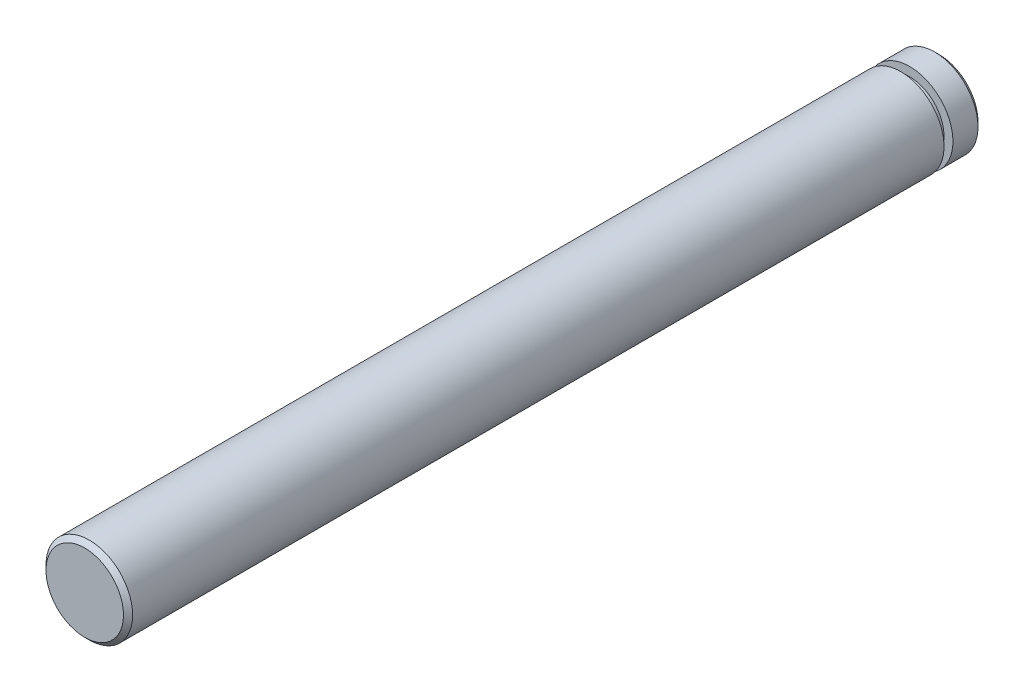
ISO-10303-21;
HEADER;
FILE_DESCRIPTION(('STEP AP214'),'2;1');
FILE_NAME('part.step','',(''),(''),'','','');
FILE_SCHEMA(('AUTOMOTIVE_DESIGN { 1 0 10303 214 1 1 1 1 }'));
ENDSEC;
DATA;
#1=APPLICATION_CONTEXT('core data for automotive mechanical design processes');
#2=APPLICATION_PROTOCOL_DEFINITION('international standard','automotive_design',2000,#1);
#3=PRODUCT_CONTEXT('',#1,'mechanical');
#4=PRODUCT('Part','Part','',(#3));
#5=PRODUCT_RELATED_PRODUCT_CATEGORY('part','',(#4));
#6=PRODUCT_DEFINITION_FORMATION('','',#4);
#7=PRODUCT_DEFINITION_CONTEXT('part definition',#1,'design');
#8=PRODUCT_DEFINITION('design','',#6,#7);
#9=PRODUCT_DEFINITION_SHAPE('','',#8);
#10=(LENGTH_UNIT() NAMED_UNIT(*) SI_UNIT(.MILLI.,.METRE.));
#11=(NAMED_UNIT(*) PLANE_ANGLE_UNIT() SI_UNIT($,.RADIAN.));
#12=(NAMED_UNIT(*) SI_UNIT($,.STERADIAN.) SOLID_ANGLE_UNIT());
#13=UNCERTAINTY_MEASURE_WITH_UNIT(LENGTH_MEASURE(1.E-05),#10,'distance_accuracy_value','');
#14=(GEOMETRIC_REPRESENTATION_CONTEXT(3) GLOBAL_UNCERTAINTY_ASSIGNED_CONTEXT((#13)) GLOBAL_UNIT_ASSIGNED_CONTEXT((#10,
#11,#12)) REPRESENTATION_CONTEXT('',''));
#15=CARTESIAN_POINT('',(0.,0.,0.));
#16=DIRECTION('',(0.,0.,1.));
#17=DIRECTION('',(1.,0.,0.));
#18=AXIS2_PLACEMENT_3D('',#15,#16,#17);
#19=CARTESIAN_POINT('',(0.,0.,95.25));
#20=DIRECTION('',(0.,0.,-1.));
#21=DIRECTION('',(-1.,0.,0.));
#22=AXIS2_PLACEMENT_3D('',#19,#20,#21);
#23=CYLINDRICAL_SURFACE('',#22,4.826);
#24=CARTESIAN_POINT('',(0.,0.,3.302));
#25=DIRECTION('',(0.,0.,-1.));
#26=DIRECTION('',(-1.,0.,0.));
#27=AXIS2_PLACEMENT_3D('',#24,#25,#26);
#28=CIRCLE('',#27,4.826);
#29=CARTESIAN_POINT('',(-4.826,0.,3.302));
#30=VERTEX_POINT('',#29);
#31=EDGE_CURVE('E75',#30,#30,#28,.T.);
#32=ORIENTED_EDGE('',*,*,#31,.T.);
#33=EDGE_LOOP('',(#32));
#34=FACE_BOUND('',#33,.T.);
#35=CARTESIAN_POINT('',(0.,0.,0.507999999999995));
#36=DIRECTION('',(0.,0.,1.));
#37=DIRECTION('',(1.,0.,0.));
#38=AXIS2_PLACEMENT_3D('',#35,#36,#37);
#39=CIRCLE('',#38,4.826);
#40=CARTESIAN_POINT('',(4.826,0.,0.507999999999995));
#41=VERTEX_POINT('',#40);
#42=EDGE_CURVE('E52',#41,#41,#39,.T.);
#43=ORIENTED_EDGE('',*,*,#42,.T.);
#44=EDGE_LOOP('',(#43));
#45=FACE_BOUND('',#44,.T.);
#46=ADVANCED_FACE('F38',(#34,#45),#23,.T.);
#47=CARTESIAN_POINT('',(0.,0.,0.));
#48=DIRECTION('',(0.,0.,1.));
#49=DIRECTION('',(1.,0.,0.));
#50=AXIS2_PLACEMENT_3D('',#47,#48,#49);
#51=PLANE('',#50);
#52=CARTESIAN_POINT('',(0.,0.,0.));
#53=DIRECTION('',(0.,0.,1.));
#54=DIRECTION('',(1.,0.,0.));
#55=AXIS2_PLACEMENT_3D('',#52,#53,#54);
#56=CIRCLE('',#55,4.318);
#57=CARTESIAN_POINT('',(4.318,0.,0.));
#58=VERTEX_POINT('',#57);
#59=EDGE_CURVE('E47',#58,#58,#56,.F.);
#60=ORIENTED_EDGE('',*,*,#59,.T.);
#61=EDGE_LOOP('',(#60));
#62=FACE_BOUND('',#61,.T.);
#63=ADVANCED_FACE('F115',(#62),#51,.F.);
#64=CARTESIAN_POINT('',(0.,0.,0.507999999999995));
#65=DIRECTION('',(0.,0.,1.));
#66=DIRECTION('',(1.,0.,0.));
#67=AXIS2_PLACEMENT_3D('',#64,#65,#66);
#68=CONICAL_SURFACE('',#67,4.826,0.78539816339745);
#69=ORIENTED_EDGE('',*,*,#59,.F.);
#70=EDGE_LOOP('',(#69));
#71=FACE_BOUND('',#70,.T.);
#72=ORIENTED_EDGE('',*,*,#42,.F.);
#73=EDGE_LOOP('',(#72));
#74=FACE_BOUND('',#73,.T.);
#75=ADVANCED_FACE('F86',(#71,#74),#68,.T.);
#76=CARTESIAN_POINT('',(0.,4.826,3.302));
#77=DIRECTION('',(0.,0.,-1.));
#78=DIRECTION('',(-1.,0.,0.));
#79=AXIS2_PLACEMENT_3D('',#76,#77,#78);
#80=PLANE('',#79);
#81=ORIENTED_EDGE('',*,*,#31,.F.);
#82=EDGE_LOOP('',(#81));
#83=FACE_BOUND('',#82,.T.);
#84=CARTESIAN_POINT('',(0.,0.,3.302));
#85=DIRECTION('',(0.,0.,-1.));
#86=DIRECTION('',(-1.,0.,0.));
#87=AXIS2_PLACEMENT_3D('',#84,#85,#86);
#88=CIRCLE('',#87,3.8354);
#89=CARTESIAN_POINT('',(-3.8354,0.,3.302));
#90=VERTEX_POINT('',#89);
#91=EDGE_CURVE('E63',#90,#90,#88,.T.);
#92=ORIENTED_EDGE('',*,*,#91,.T.);
#93=EDGE_LOOP('',(#92));
#94=FACE_BOUND('',#93,.T.);
#95=ADVANCED_FACE('F82',(#83,#94),#80,.F.);
#96=CARTESIAN_POINT('',(0.,0.,-20.8151125795333));
#97=DIRECTION('',(0.,0.,-1.));
#98=DIRECTION('',(-1.,0.,0.));
#99=AXIS2_PLACEMENT_3D('',#96,#97,#98);
#100=CYLINDRICAL_SURFACE('',#99,3.8354);
#101=ORIENTED_EDGE('',*,*,#91,.F.);
#102=EDGE_LOOP('',(#101));
#103=FACE_BOUND('',#102,.T.);
#104=CARTESIAN_POINT('',(0.,0.,4.2926));
#105=DIRECTION('',(0.,0.,-1.));
#106=DIRECTION('',(-1.,0.,0.));
#107=AXIS2_PLACEMENT_3D('',#104,#105,#106);
#108=CIRCLE('',#107,3.8354);
#109=CARTESIAN_POINT('',(-3.8354,0.,4.2926));
#110=VERTEX_POINT('',#109);
#111=EDGE_CURVE('E67',#110,#110,#108,.T.);
#112=ORIENTED_EDGE('',*,*,#111,.T.);
#113=EDGE_LOOP('',(#112));
#114=FACE_BOUND('',#113,.T.);
#115=ADVANCED_FACE('F85',(#103,#114),#100,.T.);
#116=CARTESIAN_POINT('',(0.,4.826,4.2926));
#117=DIRECTION('',(0.,0.,1.));
#118=DIRECTION('',(1.,0.,0.));
#119=AXIS2_PLACEMENT_3D('',#116,#117,#118);
#120=PLANE('',#119);
#121=ORIENTED_EDGE('',*,*,#111,.F.);
#122=EDGE_LOOP('',(#121));
#123=FACE_BOUND('',#122,.T.);
#124=CARTESIAN_POINT('',(0.,0.,4.2926));
#125=DIRECTION('',(0.,0.,-1.));
#126=DIRECTION('',(-1.,0.,0.));
#127=AXIS2_PLACEMENT_3D('',#124,#125,#126);
#128=CIRCLE('',#127,4.826);
#129=CARTESIAN_POINT('',(-4.826,0.,4.2926));
#130=VERTEX_POINT('',#129);
#131=EDGE_CURVE('E71',#130,#130,#128,.T.);
#132=ORIENTED_EDGE('',*,*,#131,.T.);
#133=EDGE_LOOP('',(#132));
#134=FACE_BOUND('',#133,.T.);
#135=ADVANCED_FACE('F92',(#123,#134),#120,.F.);
#136=CARTESIAN_POINT('',(0.,0.,95.25));
#137=DIRECTION('',(0.,0.,1.));
#138=DIRECTION('',(1.,0.,0.));
#139=AXIS2_PLACEMENT_3D('',#136,#137,#138);
#140=PLANE('',#139);
#141=CARTESIAN_POINT('',(0.,0.,95.25));
#142=DIRECTION('',(0.,0.,1.));
#143=DIRECTION('',(1.,0.,0.));
#144=AXIS2_PLACEMENT_3D('',#141,#142,#143);
#145=CIRCLE('',#144,4.31800000000002);
#146=CARTESIAN_POINT('',(4.31800000000002,0.,95.25));
#147=VERTEX_POINT('',#146);
#148=EDGE_CURVE('E10',#147,#147,#145,.T.);
#149=ORIENTED_EDGE('',*,*,#148,.T.);
#150=EDGE_LOOP('',(#149));
#151=FACE_BOUND('',#150,.T.);
#152=ADVANCED_FACE('F98',(#151),#140,.T.);
#153=CARTESIAN_POINT('',(0.,0.,95.25));
#154=DIRECTION('',(0.,0.,-1.));
#155=DIRECTION('',(-1.,0.,0.));
#156=AXIS2_PLACEMENT_3D('',#153,#154,#155);
#157=CONICAL_SURFACE('',#156,4.31800000000002,0.78539816339745);
#158=CARTESIAN_POINT('',(0.,0.,94.742));
#159=DIRECTION('',(0.,0.,1.));
#160=DIRECTION('',(1.,0.,0.));
#161=AXIS2_PLACEMENT_3D('',#158,#159,#160);
#162=CIRCLE('',#161,4.826);
#163=CARTESIAN_POINT('',(4.826,0.,94.742));
#164=VERTEX_POINT('',#163);
#165=EDGE_CURVE('E57',#164,#164,#162,.F.);
#166=ORIENTED_EDGE('',*,*,#165,.F.);
#167=EDGE_LOOP('',(#166));
#168=FACE_BOUND('',#167,.T.);
#169=ORIENTED_EDGE('',*,*,#148,.F.);
#170=EDGE_LOOP('',(#169));
#171=FACE_BOUND('',#170,.T.);
#172=ADVANCED_FACE('F41',(#168,#171),#157,.T.);
#173=ORIENTED_EDGE('',*,*,#131,.F.);
#174=EDGE_LOOP('',(#173));
#175=FACE_BOUND('',#174,.T.);
#176=ORIENTED_EDGE('',*,*,#165,.T.);
#177=EDGE_LOOP('',(#176));
#178=FACE_BOUND('',#177,.T.);
#179=ADVANCED_FACE('F102',(#175,#178),#23,.T.);
#180=CLOSED_SHELL('',(#46,#63,#75,#95,#115,#135,#152,#172,#179));
#181=MANIFOLD_SOLID_BREP('B2',#180);
#182=ADVANCED_BREP_SHAPE_REPRESENTATION('',(#18,#181),#14);
#183=SHAPE_DEFINITION_REPRESENTATION(#9,#182);
ENDSEC;
END-ISO-10303-21;
